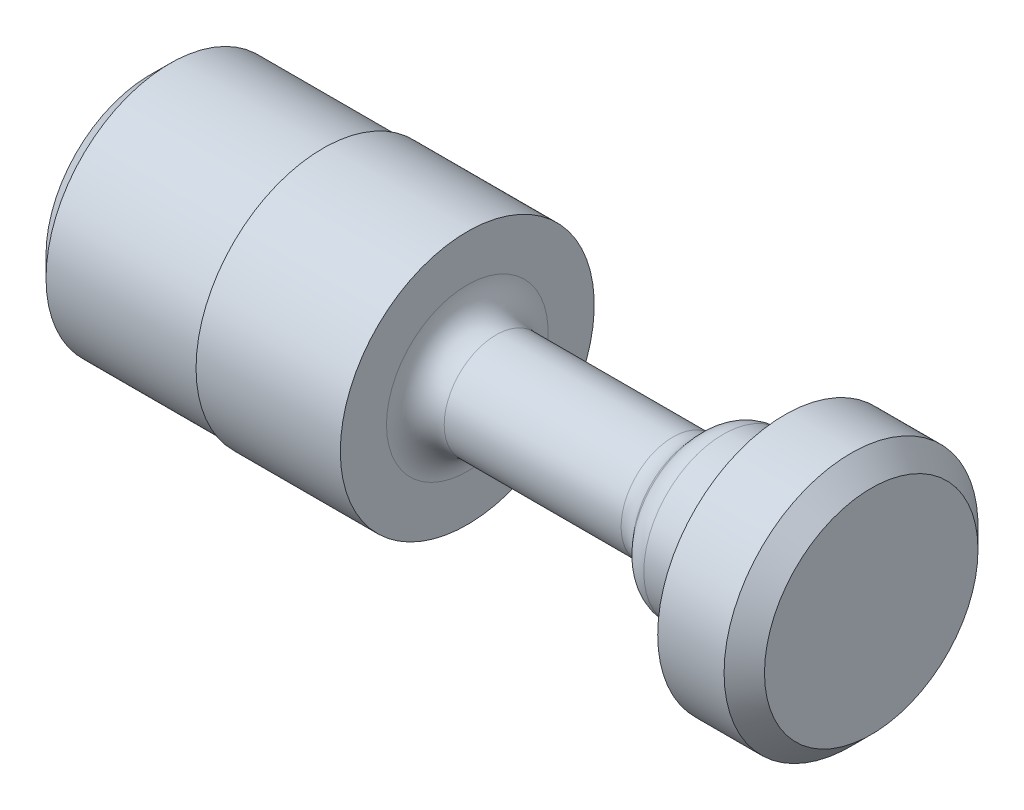
ISO-10303-21;
HEADER;
FILE_DESCRIPTION(('STEP AP214'),'2;1');
FILE_NAME('part.step','',(''),(''),'','','');
FILE_SCHEMA(('AUTOMOTIVE_DESIGN { 1 0 10303 214 1 1 1 1 }'));
ENDSEC;
DATA;
#1=APPLICATION_CONTEXT('core data for automotive mechanical design processes');
#2=APPLICATION_PROTOCOL_DEFINITION('international standard','automotive_design',2000,#1);
#3=PRODUCT_CONTEXT('',#1,'mechanical');
#4=PRODUCT('Part','Part','',(#3));
#5=PRODUCT_RELATED_PRODUCT_CATEGORY('part','',(#4));
#6=PRODUCT_DEFINITION_FORMATION('','',#4);
#7=PRODUCT_DEFINITION_CONTEXT('part definition',#1,'design');
#8=PRODUCT_DEFINITION('design','',#6,#7);
#9=PRODUCT_DEFINITION_SHAPE('','',#8);
#10=(LENGTH_UNIT() NAMED_UNIT(*) SI_UNIT(.MILLI.,.METRE.));
#11=(NAMED_UNIT(*) PLANE_ANGLE_UNIT() SI_UNIT($,.RADIAN.));
#12=(NAMED_UNIT(*) SI_UNIT($,.STERADIAN.) SOLID_ANGLE_UNIT());
#13=UNCERTAINTY_MEASURE_WITH_UNIT(LENGTH_MEASURE(1.E-05),#10,'distance_accuracy_value','');
#14=(GEOMETRIC_REPRESENTATION_CONTEXT(3) GLOBAL_UNCERTAINTY_ASSIGNED_CONTEXT((#13)) GLOBAL_UNIT_ASSIGNED_CONTEXT((#10,
#11,#12)) REPRESENTATION_CONTEXT('',''));
#15=CARTESIAN_POINT('',(0.,0.,0.));
#16=DIRECTION('',(0.,0.,1.));
#17=DIRECTION('',(1.,0.,0.));
#18=AXIS2_PLACEMENT_3D('',#15,#16,#17);
#19=CARTESIAN_POINT('',(12.5,0.,0.));
#20=DIRECTION('',(-1.,0.,0.));
#21=DIRECTION('',(0.,0.,1.));
#22=AXIS2_PLACEMENT_3D('',#19,#20,#21);
#23=PLANE('',#22);
#24=CARTESIAN_POINT('',(12.5,0.,0.));
#25=DIRECTION('',(-1.,0.,0.));
#26=DIRECTION('',(0.,0.,1.));
#27=AXIS2_PLACEMENT_3D('',#24,#25,#26);
#28=CIRCLE('',#27,3.69999999999992);
#29=CARTESIAN_POINT('',(12.5,0.,3.69999999999992));
#30=VERTEX_POINT('',#29);
#31=EDGE_CURVE('E10',#30,#30,#28,.T.);
#32=ORIENTED_EDGE('',*,*,#31,.F.);
#33=EDGE_LOOP('',(#32));
#34=FACE_BOUND('',#33,.T.);
#35=ADVANCED_FACE('F348',(#34),#23,.F.);
#36=CARTESIAN_POINT('',(12.5,0.,0.));
#37=DIRECTION('',(-1.,0.,0.));
#38=DIRECTION('',(0.,0.,1.));
#39=AXIS2_PLACEMENT_3D('',#36,#37,#38);
#40=CONICAL_SURFACE('',#39,3.69999999999992,0.785398163397449);
#41=CARTESIAN_POINT('',(11.8,0.,0.));
#42=DIRECTION('',(-1.,0.,0.));
#43=DIRECTION('',(0.,0.,1.));
#44=AXIS2_PLACEMENT_3D('',#41,#42,#43);
#45=CIRCLE('',#44,4.39999999999992);
#46=CARTESIAN_POINT('',(11.8,0.,4.39999999999992));
#47=VERTEX_POINT('',#46);
#48=EDGE_CURVE('E354',#47,#47,#45,.T.);
#49=ORIENTED_EDGE('',*,*,#48,.F.);
#50=EDGE_LOOP('',(#49));
#51=FACE_BOUND('',#50,.T.);
#52=ORIENTED_EDGE('',*,*,#31,.T.);
#53=EDGE_LOOP('',(#52));
#54=FACE_BOUND('',#53,.T.);
#55=ADVANCED_FACE('F486',(#51,#54),#40,.T.);
#56=CARTESIAN_POINT('',(-13.47216,0.,0.));
#57=DIRECTION('',(-1.,0.,0.));
#58=DIRECTION('',(0.,0.,1.));
#59=AXIS2_PLACEMENT_3D('',#56,#57,#58);
#60=CYLINDRICAL_SURFACE('',#59,4.39999999999995);
#61=CARTESIAN_POINT('',(9.49999999999998,0.,0.));
#62=DIRECTION('',(-1.,0.,0.));
#63=DIRECTION('',(0.,0.,1.));
#64=AXIS2_PLACEMENT_3D('',#61,#62,#63);
#65=CIRCLE('',#64,4.39999999999998);
#66=CARTESIAN_POINT('',(9.49999999999998,0.,4.39999999999998));
#67=VERTEX_POINT('',#66);
#68=EDGE_CURVE('E358',#67,#67,#65,.T.);
#69=ORIENTED_EDGE('',*,*,#68,.F.);
#70=EDGE_LOOP('',(#69));
#71=FACE_BOUND('',#70,.T.);
#72=ORIENTED_EDGE('',*,*,#48,.T.);
#73=EDGE_LOOP('',(#72));
#74=FACE_BOUND('',#73,.T.);
#75=ADVANCED_FACE('F481',(#71,#74),#60,.T.);
#76=CARTESIAN_POINT('',(9.49999999999999,3.55000000000001,0.));
#77=DIRECTION('',(1.,0.,0.));
#78=DIRECTION('',(0.,0.,-1.));
#79=AXIS2_PLACEMENT_3D('',#76,#77,#78);
#80=PLANE('',#79);
#81=CARTESIAN_POINT('',(9.5,0.,0.));
#82=DIRECTION('',(-1.,0.,0.));
#83=DIRECTION('',(0.,0.,1.));
#84=AXIS2_PLACEMENT_3D('',#81,#82,#83);
#85=CIRCLE('',#84,3.55000000000001);
#86=CARTESIAN_POINT('',(9.5,0.,3.55000000000001));
#87=VERTEX_POINT('',#86);
#88=EDGE_CURVE('E362',#87,#87,#85,.T.);
#89=ORIENTED_EDGE('',*,*,#88,.F.);
#90=EDGE_LOOP('',(#89));
#91=FACE_BOUND('',#90,.T.);
#92=ORIENTED_EDGE('',*,*,#68,.T.);
#93=EDGE_LOOP('',(#92));
#94=FACE_BOUND('',#93,.T.);
#95=ADVANCED_FACE('F475',(#91,#94),#80,.F.);
#96=CARTESIAN_POINT('',(8.7,0.,0.));
#97=DIRECTION('',(-1.,0.,0.));
#98=DIRECTION('',(0.,0.,1.));
#99=AXIS2_PLACEMENT_3D('',#96,#97,#98);
#100=TOROIDAL_SURFACE('',#99,3.55,0.8);
#101=CARTESIAN_POINT('',(8.7,0.,0.));
#102=DIRECTION('',(-1.,0.,0.));
#103=DIRECTION('',(0.,0.,1.));
#104=AXIS2_PLACEMENT_3D('',#101,#102,#103);
#105=CIRCLE('',#104,2.75);
#106=CARTESIAN_POINT('',(8.7,0.,2.75));
#107=VERTEX_POINT('',#106);
#108=EDGE_CURVE('E367',#107,#107,#105,.T.);
#109=ORIENTED_EDGE('',*,*,#108,.F.);
#110=EDGE_LOOP('',(#109));
#111=FACE_BOUND('',#110,.T.);
#112=ORIENTED_EDGE('',*,*,#88,.T.);
#113=EDGE_LOOP('',(#112));
#114=FACE_BOUND('',#113,.T.);
#115=ADVANCED_FACE('F469',(#111,#114),#100,.F.);
#116=CARTESIAN_POINT('',(-13.47216,0.,0.));
#117=DIRECTION('',(-1.,0.,0.));
#118=DIRECTION('',(0.,0.,1.));
#119=AXIS2_PLACEMENT_3D('',#116,#117,#118);
#120=CYLINDRICAL_SURFACE('',#119,2.75);
#121=CARTESIAN_POINT('',(7.36816599784623,0.,0.));
#122=DIRECTION('',(-1.,0.,0.));
#123=DIRECTION('',(0.,0.,1.));
#124=AXIS2_PLACEMENT_3D('',#121,#122,#123);
#125=CIRCLE('',#124,2.75);
#126=CARTESIAN_POINT('',(7.36816599784623,0.,2.75));
#127=VERTEX_POINT('',#126);
#128=EDGE_CURVE('E370',#127,#127,#125,.T.);
#129=ORIENTED_EDGE('',*,*,#128,.F.);
#130=EDGE_LOOP('',(#129));
#131=FACE_BOUND('',#130,.T.);
#132=ORIENTED_EDGE('',*,*,#108,.T.);
#133=EDGE_LOOP('',(#132));
#134=FACE_BOUND('',#133,.T.);
#135=ADVANCED_FACE('F463',(#131,#134),#120,.T.);
#136=CARTESIAN_POINT('',(7.36816599784622,0.,0.));
#137=DIRECTION('',(-1.,0.,0.));
#138=DIRECTION('',(0.,0.,1.));
#139=AXIS2_PLACEMENT_3D('',#136,#137,#138);
#140=TOROIDAL_SURFACE('',#139,1.75,1.);
#141=CARTESIAN_POINT('',(6.61481632488343,0.,0.));
#142=DIRECTION('',(-1.,0.,0.));
#143=DIRECTION('',(0.,0.,1.));
#144=AXIS2_PLACEMENT_3D('',#141,#142,#143);
#145=CIRCLE('',#144,2.40762015650895);
#146=CARTESIAN_POINT('',(6.61481632488343,0.,2.40762015650895));
#147=VERTEX_POINT('',#146);
#148=EDGE_CURVE('E373',#147,#147,#145,.T.);
#149=ORIENTED_EDGE('',*,*,#148,.F.);
#150=EDGE_LOOP('',(#149));
#151=FACE_BOUND('',#150,.T.);
#152=ORIENTED_EDGE('',*,*,#128,.T.);
#153=EDGE_LOOP('',(#152));
#154=FACE_BOUND('',#153,.T.);
#155=ADVANCED_FACE('F457',(#151,#154),#140,.T.);
#156=CARTESIAN_POINT('',(6.61481632488343,0.,0.));
#157=DIRECTION('',(1.,0.,0.));
#158=DIRECTION('',(0.,0.,-1.));
#159=AXIS2_PLACEMENT_3D('',#156,#157,#158);
#160=CONICAL_SURFACE('',#159,2.40762015650895,0.853140954667493);
#161=CARTESIAN_POINT('',(6.38328058202803,0.,0.));
#162=DIRECTION('',(-1.,0.,0.));
#163=DIRECTION('',(0.,0.,1.));
#164=AXIS2_PLACEMENT_3D('',#161,#162,#163);
#165=CIRCLE('',#164,2.14237984349105);
#166=CARTESIAN_POINT('',(6.38328058202803,0.,2.14237984349105));
#167=VERTEX_POINT('',#166);
#168=EDGE_CURVE('E376',#167,#167,#165,.T.);
#169=ORIENTED_EDGE('',*,*,#168,.F.);
#170=EDGE_LOOP('',(#169));
#171=FACE_BOUND('',#170,.T.);
#172=ORIENTED_EDGE('',*,*,#148,.T.);
#173=EDGE_LOOP('',(#172));
#174=FACE_BOUND('',#173,.T.);
#175=ADVANCED_FACE('F451',(#171,#174),#160,.T.);
#176=CARTESIAN_POINT('',(5.62993090906524,0.,0.));
#177=DIRECTION('',(-1.,0.,0.));
#178=DIRECTION('',(0.,0.,1.));
#179=AXIS2_PLACEMENT_3D('',#176,#177,#178);
#180=TOROIDAL_SURFACE('',#179,2.8,1.);
#181=CARTESIAN_POINT('',(5.62993090906523,0.,0.));
#182=DIRECTION('',(-1.,0.,0.));
#183=DIRECTION('',(0.,0.,1.));
#184=AXIS2_PLACEMENT_3D('',#181,#182,#183);
#185=CIRCLE('',#184,1.8);
#186=CARTESIAN_POINT('',(5.62993090906523,0.,1.8));
#187=VERTEX_POINT('',#186);
#188=EDGE_CURVE('E379',#187,#187,#185,.T.);
#189=ORIENTED_EDGE('',*,*,#188,.F.);
#190=EDGE_LOOP('',(#189));
#191=FACE_BOUND('',#190,.T.);
#192=ORIENTED_EDGE('',*,*,#168,.T.);
#193=EDGE_LOOP('',(#192));
#194=FACE_BOUND('',#193,.T.);
#195=ADVANCED_FACE('F445',(#191,#194),#180,.F.);
#196=CARTESIAN_POINT('',(-13.47216,0.,0.));
#197=DIRECTION('',(-1.,0.,0.));
#198=DIRECTION('',(0.,0.,1.));
#199=AXIS2_PLACEMENT_3D('',#196,#197,#198);
#200=CYLINDRICAL_SURFACE('',#199,1.8);
#201=CARTESIAN_POINT('',(-0.5,0.,0.));
#202=DIRECTION('',(-1.,0.,0.));
#203=DIRECTION('',(0.,0.,1.));
#204=AXIS2_PLACEMENT_3D('',#201,#202,#203);
#205=CIRCLE('',#204,1.8);
#206=CARTESIAN_POINT('',(-0.5,0.,1.8));
#207=VERTEX_POINT('',#206);
#208=EDGE_CURVE('E382',#207,#207,#205,.T.);
#209=ORIENTED_EDGE('',*,*,#208,.F.);
#210=EDGE_LOOP('',(#209));
#211=FACE_BOUND('',#210,.T.);
#212=ORIENTED_EDGE('',*,*,#188,.T.);
#213=EDGE_LOOP('',(#212));
#214=FACE_BOUND('',#213,.T.);
#215=ADVANCED_FACE('F439',(#211,#214),#200,.T.);
#216=CARTESIAN_POINT('',(-0.5,0.,0.));
#217=DIRECTION('',(-1.,0.,0.));
#218=DIRECTION('',(0.,0.,1.));
#219=AXIS2_PLACEMENT_3D('',#216,#217,#218);
#220=TOROIDAL_SURFACE('',#219,2.8,1.);
#221=CARTESIAN_POINT('',(-1.5,0.,0.));
#222=DIRECTION('',(-1.,0.,0.));
#223=DIRECTION('',(0.,0.,1.));
#224=AXIS2_PLACEMENT_3D('',#221,#222,#223);
#225=CIRCLE('',#224,2.8);
#226=CARTESIAN_POINT('',(-1.5,0.,2.8));
#227=VERTEX_POINT('',#226);
#228=EDGE_CURVE('E385',#227,#227,#225,.T.);
#229=ORIENTED_EDGE('',*,*,#228,.F.);
#230=EDGE_LOOP('',(#229));
#231=FACE_BOUND('',#230,.T.);
#232=ORIENTED_EDGE('',*,*,#208,.T.);
#233=EDGE_LOOP('',(#232));
#234=FACE_BOUND('',#233,.T.);
#235=ADVANCED_FACE('F433',(#231,#234),#220,.F.);
#236=CARTESIAN_POINT('',(-1.5,4.4,0.));
#237=DIRECTION('',(-1.,0.,0.));
#238=DIRECTION('',(0.,0.,1.));
#239=AXIS2_PLACEMENT_3D('',#236,#237,#238);
#240=PLANE('',#239);
#241=CARTESIAN_POINT('',(-1.5,0.,0.));
#242=DIRECTION('',(-1.,0.,0.));
#243=DIRECTION('',(0.,0.,1.));
#244=AXIS2_PLACEMENT_3D('',#241,#242,#243);
#245=CIRCLE('',#244,4.4);
#246=CARTESIAN_POINT('',(-1.5,0.,4.4));
#247=VERTEX_POINT('',#246);
#248=EDGE_CURVE('E388',#247,#247,#245,.T.);
#249=ORIENTED_EDGE('',*,*,#248,.F.);
#250=EDGE_LOOP('',(#249));
#251=FACE_BOUND('',#250,.T.);
#252=ORIENTED_EDGE('',*,*,#228,.T.);
#253=EDGE_LOOP('',(#252));
#254=FACE_BOUND('',#253,.T.);
#255=ADVANCED_FACE('F427',(#251,#254),#240,.F.);
#256=CARTESIAN_POINT('',(-13.47216,0.,0.));
#257=DIRECTION('',(-1.,0.,0.));
#258=DIRECTION('',(0.,0.,1.));
#259=AXIS2_PLACEMENT_3D('',#256,#257,#258);
#260=CYLINDRICAL_SURFACE('',#259,4.4);
#261=CARTESIAN_POINT('',(-6.5,0.,0.));
#262=DIRECTION('',(-1.,0.,0.));
#263=DIRECTION('',(0.,0.,1.));
#264=AXIS2_PLACEMENT_3D('',#261,#262,#263);
#265=CIRCLE('',#264,4.4);
#266=CARTESIAN_POINT('',(-6.5,0.,4.4));
#267=VERTEX_POINT('',#266);
#268=EDGE_CURVE('E391',#267,#267,#265,.T.);
#269=ORIENTED_EDGE('',*,*,#268,.F.);
#270=EDGE_LOOP('',(#269));
#271=FACE_BOUND('',#270,.T.);
#272=ORIENTED_EDGE('',*,*,#248,.T.);
#273=EDGE_LOOP('',(#272));
#274=FACE_BOUND('',#273,.T.);
#275=ADVANCED_FACE('F421',(#271,#274),#260,.T.);
#276=CARTESIAN_POINT('',(-6.5,4.4,0.));
#277=DIRECTION('',(1.,0.,0.));
#278=DIRECTION('',(0.,0.,-1.));
#279=AXIS2_PLACEMENT_3D('',#276,#277,#278);
#280=PLANE('',#279);
#281=CARTESIAN_POINT('',(-6.5,0.,0.));
#282=DIRECTION('',(-1.,0.,0.));
#283=DIRECTION('',(0.,0.,1.));
#284=AXIS2_PLACEMENT_3D('',#281,#282,#283);
#285=CIRCLE('',#284,4.3);
#286=CARTESIAN_POINT('',(-6.5,0.,4.3));
#287=VERTEX_POINT('',#286);
#288=EDGE_CURVE('E394',#287,#287,#285,.T.);
#289=ORIENTED_EDGE('',*,*,#288,.F.);
#290=EDGE_LOOP('',(#289));
#291=FACE_BOUND('',#290,.T.);
#292=ORIENTED_EDGE('',*,*,#268,.T.);
#293=EDGE_LOOP('',(#292));
#294=FACE_BOUND('',#293,.T.);
#295=ADVANCED_FACE('F415',(#291,#294),#280,.F.);
#296=CARTESIAN_POINT('',(-13.47216,0.,0.));
#297=DIRECTION('',(-1.,0.,0.));
#298=DIRECTION('',(0.,0.,1.));
#299=AXIS2_PLACEMENT_3D('',#296,#297,#298);
#300=CYLINDRICAL_SURFACE('',#299,4.3);
#301=CARTESIAN_POINT('',(-11.8,0.,0.));
#302=DIRECTION('',(-1.,0.,0.));
#303=DIRECTION('',(0.,0.,1.));
#304=AXIS2_PLACEMENT_3D('',#301,#302,#303);
#305=CIRCLE('',#304,4.3);
#306=CARTESIAN_POINT('',(-11.8,0.,4.3));
#307=VERTEX_POINT('',#306);
#308=EDGE_CURVE('E397',#307,#307,#305,.T.);
#309=ORIENTED_EDGE('',*,*,#308,.F.);
#310=EDGE_LOOP('',(#309));
#311=FACE_BOUND('',#310,.T.);
#312=ORIENTED_EDGE('',*,*,#288,.T.);
#313=EDGE_LOOP('',(#312));
#314=FACE_BOUND('',#313,.T.);
#315=ADVANCED_FACE('F409',(#311,#314),#300,.T.);
#316=CARTESIAN_POINT('',(-11.8,0.,0.));
#317=DIRECTION('',(1.,0.,0.));
#318=DIRECTION('',(0.,0.,-1.));
#319=AXIS2_PLACEMENT_3D('',#316,#317,#318);
#320=CONICAL_SURFACE('',#319,4.3,0.785398163397449);
#321=CARTESIAN_POINT('',(-12.5,0.,0.));
#322=DIRECTION('',(-1.,0.,0.));
#323=DIRECTION('',(0.,0.,1.));
#324=AXIS2_PLACEMENT_3D('',#321,#322,#323);
#325=CIRCLE('',#324,3.6);
#326=CARTESIAN_POINT('',(-12.5,0.,3.6));
#327=VERTEX_POINT('',#326);
#328=EDGE_CURVE('E400',#327,#327,#325,.T.);
#329=ORIENTED_EDGE('',*,*,#328,.F.);
#330=EDGE_LOOP('',(#329));
#331=FACE_BOUND('',#330,.T.);
#332=ORIENTED_EDGE('',*,*,#308,.T.);
#333=EDGE_LOOP('',(#332));
#334=FACE_BOUND('',#333,.T.);
#335=ADVANCED_FACE('F406',(#331,#334),#320,.T.);
#336=CARTESIAN_POINT('',(-12.5,0.,0.));
#337=DIRECTION('',(1.,0.,0.));
#338=DIRECTION('',(0.,0.,-1.));
#339=AXIS2_PLACEMENT_3D('',#336,#337,#338);
#340=PLANE('',#339);
#341=ORIENTED_EDGE('',*,*,#328,.T.);
#342=EDGE_LOOP('',(#341));
#343=FACE_BOUND('',#342,.T.);
#344=ADVANCED_FACE('F404',(#343),#340,.F.);
#345=CLOSED_SHELL('',(#35,#55,#75,#95,#115,#135,#155,#175,#195,#215,#235,#255,#275,#295,#315,
#335,#344));
#346=MANIFOLD_SOLID_BREP('B2',#345);
#347=ADVANCED_BREP_SHAPE_REPRESENTATION('',(#18,#346),#14);
#348=SHAPE_DEFINITION_REPRESENTATION(#9,#347);
ENDSEC;
END-ISO-10303-21;
